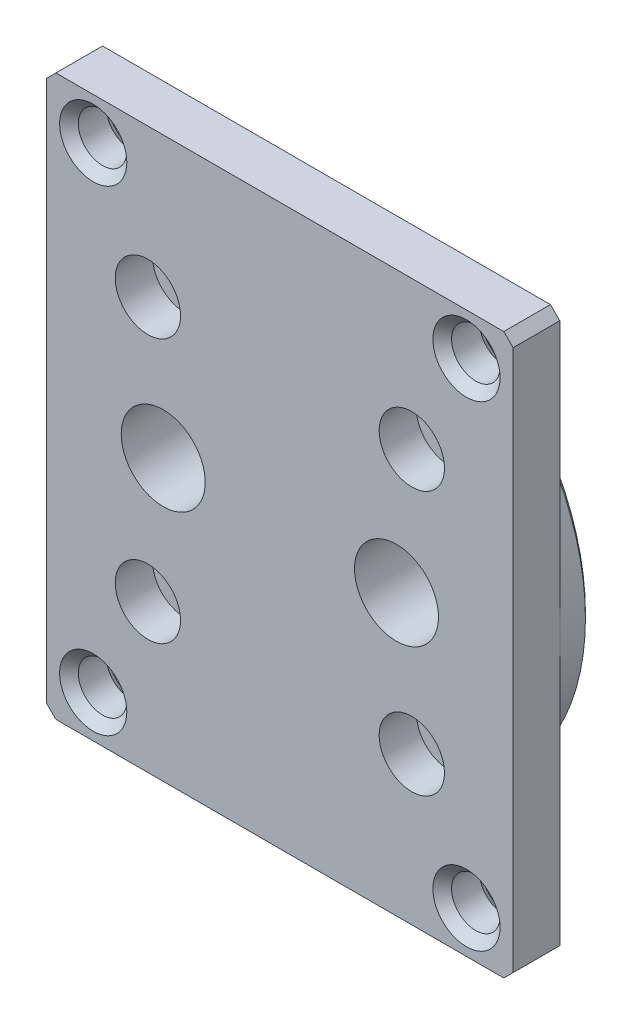
ISO-10303-21;
HEADER;
FILE_DESCRIPTION(('STEP AP214'),'2;1');
FILE_NAME('part.step','',(''),(''),'','','');
FILE_SCHEMA(('AUTOMOTIVE_DESIGN { 1 0 10303 214 1 1 1 1 }'));
ENDSEC;
DATA;
#1=APPLICATION_CONTEXT('core data for automotive mechanical design processes');
#2=APPLICATION_PROTOCOL_DEFINITION('international standard','automotive_design',2000,#1);
#3=PRODUCT_CONTEXT('',#1,'mechanical');
#4=PRODUCT('Part','Part','',(#3));
#5=PRODUCT_RELATED_PRODUCT_CATEGORY('part','',(#4));
#6=PRODUCT_DEFINITION_FORMATION('','',#4);
#7=PRODUCT_DEFINITION_CONTEXT('part definition',#1,'design');
#8=PRODUCT_DEFINITION('design','',#6,#7);
#9=PRODUCT_DEFINITION_SHAPE('','',#8);
#10=(LENGTH_UNIT() NAMED_UNIT(*) SI_UNIT(.MILLI.,.METRE.));
#11=(NAMED_UNIT(*) PLANE_ANGLE_UNIT() SI_UNIT($,.RADIAN.));
#12=(NAMED_UNIT(*) SI_UNIT($,.STERADIAN.) SOLID_ANGLE_UNIT());
#13=UNCERTAINTY_MEASURE_WITH_UNIT(LENGTH_MEASURE(1.E-05),#10,'distance_accuracy_value','');
#14=(GEOMETRIC_REPRESENTATION_CONTEXT(3) GLOBAL_UNCERTAINTY_ASSIGNED_CONTEXT((#13)) GLOBAL_UNIT_ASSIGNED_CONTEXT((#10,
#11,#12)) REPRESENTATION_CONTEXT('',''));
#15=CARTESIAN_POINT('',(0.,0.,0.));
#16=DIRECTION('',(0.,0.,1.));
#17=DIRECTION('',(1.,0.,0.));
#18=AXIS2_PLACEMENT_3D('',#15,#16,#17);
#19=CARTESIAN_POINT('',(14.142135623731,-14.1421356237309,8.25));
#20=DIRECTION('',(0.,0.,-1.));
#21=DIRECTION('',(-1.,0.,0.));
#22=AXIS2_PLACEMENT_3D('',#19,#20,#21);
#23=CYLINDRICAL_SURFACE('',#22,1.75);
#24=CARTESIAN_POINT('',(14.142135623731,-14.1421356237309,0.500000000000016));
#25=DIRECTION('',(0.,0.,1.));
#26=DIRECTION('',(1.,0.,0.));
#27=AXIS2_PLACEMENT_3D('',#24,#25,#26);
#28=CIRCLE('',#27,1.75);
#29=CARTESIAN_POINT('',(15.892135623731,-14.1421356237309,0.500000000000016));
#30=VERTEX_POINT('',#29);
#31=EDGE_CURVE('E216',#30,#30,#28,.F.);
#32=ORIENTED_EDGE('',*,*,#31,.T.);
#33=EDGE_LOOP('',(#32));
#34=FACE_BOUND('',#33,.T.);
#35=CARTESIAN_POINT('',(14.142135623731,-14.1421356237309,4.25));
#36=DIRECTION('',(0.,0.,1.));
#37=DIRECTION('',(1.,0.,0.));
#38=AXIS2_PLACEMENT_3D('',#35,#36,#37);
#39=CIRCLE('',#38,1.75);
#40=CARTESIAN_POINT('',(15.892135623731,-14.1421356237309,4.25));
#41=VERTEX_POINT('',#40);
#42=EDGE_CURVE('E176',#41,#41,#39,.F.);
#43=ORIENTED_EDGE('',*,*,#42,.F.);
#44=EDGE_LOOP('',(#43));
#45=FACE_BOUND('',#44,.T.);
#46=ADVANCED_FACE('F41',(#34,#45),#23,.F.);
#47=CARTESIAN_POINT('',(-14.142135623731,-14.1421356237309,8.25));
#48=DIRECTION('',(0.,0.,-1.));
#49=DIRECTION('',(-1.,0.,0.));
#50=AXIS2_PLACEMENT_3D('',#47,#48,#49);
#51=CYLINDRICAL_SURFACE('',#50,1.75);
#52=CARTESIAN_POINT('',(-14.142135623731,-14.1421356237309,0.500000000000007));
#53=DIRECTION('',(0.,0.,1.));
#54=DIRECTION('',(1.,0.,0.));
#55=AXIS2_PLACEMENT_3D('',#52,#53,#54);
#56=CIRCLE('',#55,1.75);
#57=CARTESIAN_POINT('',(-12.392135623731,-14.1421356237309,0.500000000000007));
#58=VERTEX_POINT('',#57);
#59=EDGE_CURVE('E220',#58,#58,#56,.F.);
#60=ORIENTED_EDGE('',*,*,#59,.T.);
#61=EDGE_LOOP('',(#60));
#62=FACE_BOUND('',#61,.T.);
#63=CARTESIAN_POINT('',(-14.142135623731,-14.1421356237309,4.25));
#64=DIRECTION('',(0.,0.,1.));
#65=DIRECTION('',(1.,0.,0.));
#66=AXIS2_PLACEMENT_3D('',#63,#64,#65);
#67=CIRCLE('',#66,1.75);
#68=CARTESIAN_POINT('',(-12.392135623731,-14.1421356237309,4.25));
#69=VERTEX_POINT('',#68);
#70=EDGE_CURVE('E171',#69,#69,#67,.F.);
#71=ORIENTED_EDGE('',*,*,#70,.F.);
#72=EDGE_LOOP('',(#71));
#73=FACE_BOUND('',#72,.T.);
#74=ADVANCED_FACE('F419',(#62,#73),#51,.F.);
#75=CARTESIAN_POINT('',(14.142135623731,14.142135623731,8.25));
#76=DIRECTION('',(0.,0.,-1.));
#77=DIRECTION('',(-1.,0.,0.));
#78=AXIS2_PLACEMENT_3D('',#75,#76,#77);
#79=CYLINDRICAL_SURFACE('',#78,1.75);
#80=CARTESIAN_POINT('',(14.142135623731,14.142135623731,0.500000000000004));
#81=DIRECTION('',(0.,0.,1.));
#82=DIRECTION('',(1.,0.,0.));
#83=AXIS2_PLACEMENT_3D('',#80,#81,#82);
#84=CIRCLE('',#83,1.75);
#85=CARTESIAN_POINT('',(15.892135623731,14.142135623731,0.500000000000004));
#86=VERTEX_POINT('',#85);
#87=EDGE_CURVE('E228',#86,#86,#84,.F.);
#88=ORIENTED_EDGE('',*,*,#87,.T.);
#89=EDGE_LOOP('',(#88));
#90=FACE_BOUND('',#89,.T.);
#91=CARTESIAN_POINT('',(14.142135623731,14.142135623731,4.25));
#92=DIRECTION('',(0.,0.,1.));
#93=DIRECTION('',(1.,0.,0.));
#94=AXIS2_PLACEMENT_3D('',#91,#92,#93);
#95=CIRCLE('',#94,1.75);
#96=CARTESIAN_POINT('',(15.892135623731,14.142135623731,4.25));
#97=VERTEX_POINT('',#96);
#98=EDGE_CURVE('E167',#97,#97,#95,.F.);
#99=ORIENTED_EDGE('',*,*,#98,.F.);
#100=EDGE_LOOP('',(#99));
#101=FACE_BOUND('',#100,.T.);
#102=ADVANCED_FACE('F425',(#90,#101),#79,.F.);
#103=CARTESIAN_POINT('',(-14.142135623731,14.142135623731,8.25));
#104=DIRECTION('',(0.,0.,-1.));
#105=DIRECTION('',(-1.,0.,0.));
#106=AXIS2_PLACEMENT_3D('',#103,#104,#105);
#107=CYLINDRICAL_SURFACE('',#106,1.75);
#108=CARTESIAN_POINT('',(-14.142135623731,14.142135623731,0.500000000000007));
#109=DIRECTION('',(0.,0.,1.));
#110=DIRECTION('',(1.,0.,0.));
#111=AXIS2_PLACEMENT_3D('',#108,#109,#110);
#112=CIRCLE('',#111,1.75);
#113=CARTESIAN_POINT('',(-12.392135623731,14.142135623731,0.500000000000007));
#114=VERTEX_POINT('',#113);
#115=EDGE_CURVE('E224',#114,#114,#112,.F.);
#116=ORIENTED_EDGE('',*,*,#115,.T.);
#117=EDGE_LOOP('',(#116));
#118=FACE_BOUND('',#117,.T.);
#119=CARTESIAN_POINT('',(-14.142135623731,14.142135623731,4.25));
#120=DIRECTION('',(0.,0.,1.));
#121=DIRECTION('',(1.,0.,0.));
#122=AXIS2_PLACEMENT_3D('',#119,#120,#121);
#123=CIRCLE('',#122,1.75);
#124=CARTESIAN_POINT('',(-12.392135623731,14.142135623731,4.25));
#125=VERTEX_POINT('',#124);
#126=EDGE_CURVE('E161',#125,#125,#123,.F.);
#127=ORIENTED_EDGE('',*,*,#126,.F.);
#128=EDGE_LOOP('',(#127));
#129=FACE_BOUND('',#128,.T.);
#130=ADVANCED_FACE('F434',(#118,#129),#107,.F.);
#131=CARTESIAN_POINT('',(0.,0.,8.25));
#132=DIRECTION('',(0.,0.,-1.));
#133=DIRECTION('',(-1.,0.,0.));
#134=AXIS2_PLACEMENT_3D('',#131,#132,#133);
#135=CYLINDRICAL_SURFACE('',#134,25.);
#136=CARTESIAN_POINT('',(0.,0.,0.5));
#137=DIRECTION('',(0.,0.,1.));
#138=DIRECTION('',(1.,0.,0.));
#139=AXIS2_PLACEMENT_3D('',#136,#137,#138);
#140=CIRCLE('',#139,25.);
#141=CARTESIAN_POINT('',(25.,0.,0.5));
#142=VERTEX_POINT('',#141);
#143=EDGE_CURVE('E136',#142,#142,#140,.T.);
#144=ORIENTED_EDGE('',*,*,#143,.T.);
#145=EDGE_LOOP('',(#144));
#146=FACE_BOUND('',#145,.T.);
#147=CARTESIAN_POINT('',(0.,0.,3.25));
#148=DIRECTION('',(0.,0.,1.));
#149=DIRECTION('',(1.,0.,0.));
#150=AXIS2_PLACEMENT_3D('',#147,#148,#149);
#151=CIRCLE('',#150,25.);
#152=CARTESIAN_POINT('',(25.,0.,3.25));
#153=VERTEX_POINT('',#152);
#154=CARTESIAN_POINT('',(-25.,0.,3.25));
#155=VERTEX_POINT('',#154);
#156=EDGE_CURVE('E130',#153,#155,#151,.T.);
#157=ORIENTED_EDGE('',*,*,#156,.F.);
#158=EDGE_CURVE('E125',#155,#153,#151,.T.);
#159=ORIENTED_EDGE('',*,*,#158,.F.);
#160=EDGE_LOOP('',(#157,#159));
#161=FACE_BOUND('',#160,.T.);
#162=ADVANCED_FACE('F131',(#146,#161),#135,.T.);
#163=CARTESIAN_POINT('',(0.,0.,0.));
#164=DIRECTION('',(0.,0.,1.));
#165=DIRECTION('',(1.,0.,0.));
#166=AXIS2_PLACEMENT_3D('',#163,#164,#165);
#167=PLANE('',#166);
#168=CARTESIAN_POINT('',(0.,0.,0.));
#169=DIRECTION('',(0.,0.,1.));
#170=DIRECTION('',(1.,0.,0.));
#171=AXIS2_PLACEMENT_3D('',#168,#169,#170);
#172=CIRCLE('',#171,24.5);
#173=CARTESIAN_POINT('',(24.5,0.,0.));
#174=VERTEX_POINT('',#173);
#175=EDGE_CURVE('E208',#174,#174,#172,.F.);
#176=ORIENTED_EDGE('',*,*,#175,.T.);
#177=EDGE_LOOP('',(#176));
#178=FACE_BOUND('',#177,.T.);
#179=CARTESIAN_POINT('',(-12.5,0.,0.));
#180=DIRECTION('',(0.,0.,1.));
#181=DIRECTION('',(1.,0.,0.));
#182=AXIS2_PLACEMENT_3D('',#179,#180,#181);
#183=CIRCLE('',#182,5.);
#184=CARTESIAN_POINT('',(-7.50000000000001,0.,0.));
#185=VERTEX_POINT('',#184);
#186=EDGE_CURVE('E204',#185,#185,#183,.T.);
#187=ORIENTED_EDGE('',*,*,#186,.T.);
#188=EDGE_LOOP('',(#187));
#189=FACE_BOUND('',#188,.T.);
#190=CARTESIAN_POINT('',(14.142135623731,-14.1421356237309,0.));
#191=DIRECTION('',(0.,0.,1.));
#192=DIRECTION('',(1.,0.,0.));
#193=AXIS2_PLACEMENT_3D('',#190,#191,#192);
#194=CIRCLE('',#193,2.25000000000001);
#195=CARTESIAN_POINT('',(16.392135623731,-14.1421356237309,0.));
#196=VERTEX_POINT('',#195);
#197=EDGE_CURVE('E200',#196,#196,#194,.T.);
#198=ORIENTED_EDGE('',*,*,#197,.T.);
#199=EDGE_LOOP('',(#198));
#200=FACE_BOUND('',#199,.T.);
#201=CARTESIAN_POINT('',(-14.142135623731,-14.1421356237309,0.));
#202=DIRECTION('',(0.,0.,1.));
#203=DIRECTION('',(1.,0.,0.));
#204=AXIS2_PLACEMENT_3D('',#201,#202,#203);
#205=CIRCLE('',#204,2.25);
#206=CARTESIAN_POINT('',(-11.892135623731,-14.1421356237309,0.));
#207=VERTEX_POINT('',#206);
#208=EDGE_CURVE('E196',#207,#207,#205,.T.);
#209=ORIENTED_EDGE('',*,*,#208,.T.);
#210=EDGE_LOOP('',(#209));
#211=FACE_BOUND('',#210,.T.);
#212=CARTESIAN_POINT('',(-14.142135623731,14.142135623731,0.));
#213=DIRECTION('',(0.,0.,1.));
#214=DIRECTION('',(1.,0.,0.));
#215=AXIS2_PLACEMENT_3D('',#212,#213,#214);
#216=CIRCLE('',#215,2.25);
#217=CARTESIAN_POINT('',(-11.892135623731,14.142135623731,0.));
#218=VERTEX_POINT('',#217);
#219=EDGE_CURVE('E192',#218,#218,#216,.T.);
#220=ORIENTED_EDGE('',*,*,#219,.T.);
#221=EDGE_LOOP('',(#220));
#222=FACE_BOUND('',#221,.T.);
#223=CARTESIAN_POINT('',(14.142135623731,14.142135623731,0.));
#224=DIRECTION('',(0.,0.,1.));
#225=DIRECTION('',(1.,0.,0.));
#226=AXIS2_PLACEMENT_3D('',#223,#224,#225);
#227=CIRCLE('',#226,2.25);
#228=CARTESIAN_POINT('',(16.392135623731,14.142135623731,0.));
#229=VERTEX_POINT('',#228);
#230=EDGE_CURVE('E188',#229,#229,#227,.T.);
#231=ORIENTED_EDGE('',*,*,#230,.T.);
#232=EDGE_LOOP('',(#231));
#233=FACE_BOUND('',#232,.T.);
#234=CARTESIAN_POINT('',(12.5,0.,0.));
#235=DIRECTION('',(0.,0.,1.));
#236=DIRECTION('',(1.,0.,0.));
#237=AXIS2_PLACEMENT_3D('',#234,#235,#236);
#238=CIRCLE('',#237,5.00000000000002);
#239=CARTESIAN_POINT('',(17.5,0.,0.));
#240=VERTEX_POINT('',#239);
#241=EDGE_CURVE('E184',#240,#240,#238,.T.);
#242=ORIENTED_EDGE('',*,*,#241,.T.);
#243=EDGE_LOOP('',(#242));
#244=FACE_BOUND('',#243,.T.);
#245=ADVANCED_FACE('F441',(#178,#189,#200,#211,#222,#233,#244),#167,.F.);
#246=CARTESIAN_POINT('',(0.,0.,3.25));
#247=DIRECTION('',(0.,0.,1.));
#248=DIRECTION('',(1.,0.,0.));
#249=AXIS2_PLACEMENT_3D('',#246,#247,#248);
#250=PLANE('',#249);
#251=CARTESIAN_POINT('',(20.,25.5,3.25));
#252=DIRECTION('',(0.,0.,1.));
#253=DIRECTION('',(1.,0.,0.));
#254=AXIS2_PLACEMENT_3D('',#251,#252,#253);
#255=CIRCLE('',#254,3.59999999999999);
#256=CARTESIAN_POINT('',(23.6,25.5,3.25));
#257=VERTEX_POINT('',#256);
#258=EDGE_CURVE('E253',#257,#257,#255,.T.);
#259=ORIENTED_EDGE('',*,*,#258,.T.);
#260=EDGE_LOOP('',(#259));
#261=FACE_BOUND('',#260,.T.);
#262=CARTESIAN_POINT('',(-20.,25.5,3.25));
#263=DIRECTION('',(0.,0.,1.));
#264=DIRECTION('',(1.,0.,0.));
#265=AXIS2_PLACEMENT_3D('',#262,#263,#264);
#266=CIRCLE('',#265,3.59999999999999);
#267=CARTESIAN_POINT('',(-16.4,25.5,3.25));
#268=VERTEX_POINT('',#267);
#269=EDGE_CURVE('E249',#268,#268,#266,.T.);
#270=ORIENTED_EDGE('',*,*,#269,.T.);
#271=EDGE_LOOP('',(#270));
#272=FACE_BOUND('',#271,.T.);
#273=DIRECTION('',(0.,-1.,0.));
#274=VECTOR('',#273,1.);
#275=CARTESIAN_POINT('',(-25.,25.,3.25));
#276=LINE('',#275,#274);
#277=CARTESIAN_POINT('',(-25.,29.,3.25));
#278=VERTEX_POINT('',#277);
#279=EDGE_CURVE('E147',#278,#155,#276,.T.);
#280=ORIENTED_EDGE('',*,*,#279,.F.);
#281=DIRECTION('',(-0.707106781186548,-0.707106781186548,0.));
#282=VECTOR('',#281,1.);
#283=CARTESIAN_POINT('',(-24.,30.,3.25));
#284=LINE('',#283,#282);
#285=CARTESIAN_POINT('',(-24.,30.,3.25));
#286=VERTEX_POINT('',#285);
#287=EDGE_CURVE('E246',#278,#286,#284,.F.);
#288=ORIENTED_EDGE('',*,*,#287,.T.);
#289=DIRECTION('',(1.,0.,0.));
#290=VECTOR('',#289,1.);
#291=CARTESIAN_POINT('',(-25.,30.,3.25));
#292=LINE('',#291,#290);
#293=CARTESIAN_POINT('',(24.,30.,3.25));
#294=VERTEX_POINT('',#293);
#295=EDGE_CURVE('E360',#286,#294,#292,.T.);
#296=ORIENTED_EDGE('',*,*,#295,.T.);
#297=DIRECTION('',(-0.707106781186548,0.707106781186548,0.));
#298=VECTOR('',#297,1.);
#299=CARTESIAN_POINT('',(25.,29.,3.25));
#300=LINE('',#299,#298);
#301=CARTESIAN_POINT('',(25.,29.,3.25));
#302=VERTEX_POINT('',#301);
#303=EDGE_CURVE('E145',#294,#302,#300,.F.);
#304=ORIENTED_EDGE('',*,*,#303,.T.);
#305=DIRECTION('',(0.,1.,0.));
#306=VECTOR('',#305,1.);
#307=CARTESIAN_POINT('',(25.,25.,3.25));
#308=LINE('',#307,#306);
#309=EDGE_CURVE('E120',#153,#302,#308,.T.);
#310=ORIENTED_EDGE('',*,*,#309,.F.);
#311=ORIENTED_EDGE('',*,*,#156,.T.);
#312=EDGE_LOOP('',(#280,#288,#296,#304,#310,#311));
#313=FACE_BOUND('',#312,.T.);
#314=ADVANCED_FACE('F142',(#261,#272,#313),#250,.F.);
#315=CARTESIAN_POINT('',(-20.,-25.5,3.25));
#316=DIRECTION('',(0.,0.,1.));
#317=DIRECTION('',(1.,0.,0.));
#318=AXIS2_PLACEMENT_3D('',#315,#316,#317);
#319=CIRCLE('',#318,3.60000000000001);
#320=CARTESIAN_POINT('',(-16.4,-25.5,3.25));
#321=VERTEX_POINT('',#320);
#322=EDGE_CURVE('E310',#321,#321,#319,.T.);
#323=ORIENTED_EDGE('',*,*,#322,.T.);
#324=EDGE_LOOP('',(#323));
#325=FACE_BOUND('',#324,.T.);
#326=CARTESIAN_POINT('',(20.,-25.5,3.25));
#327=DIRECTION('',(0.,0.,1.));
#328=DIRECTION('',(1.,0.,0.));
#329=AXIS2_PLACEMENT_3D('',#326,#327,#328);
#330=CIRCLE('',#329,3.59999999999999);
#331=CARTESIAN_POINT('',(23.6,-25.5,3.25));
#332=VERTEX_POINT('',#331);
#333=EDGE_CURVE('E306',#332,#332,#330,.T.);
#334=ORIENTED_EDGE('',*,*,#333,.T.);
#335=EDGE_LOOP('',(#334));
#336=FACE_BOUND('',#335,.T.);
#337=DIRECTION('',(-1.,0.,0.));
#338=VECTOR('',#337,1.);
#339=CARTESIAN_POINT('',(-25.,-30.,3.25));
#340=LINE('',#339,#338);
#341=CARTESIAN_POINT('',(24.,-30.,3.25));
#342=VERTEX_POINT('',#341);
#343=CARTESIAN_POINT('',(-24.,-30.,3.25));
#344=VERTEX_POINT('',#343);
#345=EDGE_CURVE('E353',#342,#344,#340,.T.);
#346=ORIENTED_EDGE('',*,*,#345,.T.);
#347=DIRECTION('',(0.707106781186546,-0.707106781186549,0.));
#348=VECTOR('',#347,1.);
#349=CARTESIAN_POINT('',(-25.,-29.,3.25));
#350=LINE('',#349,#348);
#351=CARTESIAN_POINT('',(-25.,-29.,3.25));
#352=VERTEX_POINT('',#351);
#353=EDGE_CURVE('E303',#344,#352,#350,.F.);
#354=ORIENTED_EDGE('',*,*,#353,.T.);
#355=EDGE_CURVE('E140',#155,#352,#276,.T.);
#356=ORIENTED_EDGE('',*,*,#355,.F.);
#357=ORIENTED_EDGE('',*,*,#158,.T.);
#358=CARTESIAN_POINT('',(25.,-29.,3.25));
#359=VERTEX_POINT('',#358);
#360=EDGE_CURVE('E114',#359,#153,#308,.T.);
#361=ORIENTED_EDGE('',*,*,#360,.F.);
#362=DIRECTION('',(0.707106781186545,0.70710678118655,0.));
#363=VECTOR('',#362,1.);
#364=CARTESIAN_POINT('',(24.,-30.,3.25));
#365=LINE('',#364,#363);
#366=EDGE_CURVE('E65',#359,#342,#365,.F.);
#367=ORIENTED_EDGE('',*,*,#366,.T.);
#368=EDGE_LOOP('',(#346,#354,#356,#357,#361,#367));
#369=FACE_BOUND('',#368,.T.);
#370=ADVANCED_FACE('F138',(#325,#336,#369),#250,.F.);
#371=CARTESIAN_POINT('',(-25.,25.,3.25));
#372=DIRECTION('',(-1.,0.,0.));
#373=DIRECTION('',(0.,-1.,0.));
#374=AXIS2_PLACEMENT_3D('',#371,#372,#373);
#375=PLANE('',#374);
#376=DIRECTION('',(0.,-1.,0.));
#377=VECTOR('',#376,1.);
#378=CARTESIAN_POINT('',(-25.,25.,8.25));
#379=LINE('',#378,#377);
#380=CARTESIAN_POINT('',(-25.,29.,8.25));
#381=VERTEX_POINT('',#380);
#382=CARTESIAN_POINT('',(-25.,-29.,8.25));
#383=VERTEX_POINT('',#382);
#384=EDGE_CURVE('E152',#381,#383,#379,.T.);
#385=ORIENTED_EDGE('',*,*,#384,.F.);
#386=DIRECTION('',(0.,0.,-1.));
#387=VECTOR('',#386,1.);
#388=CARTESIAN_POINT('',(-25.,29.,3.25));
#389=LINE('',#388,#387);
#390=EDGE_CURVE('E333',#381,#278,#389,.T.);
#391=ORIENTED_EDGE('',*,*,#390,.T.);
#392=ORIENTED_EDGE('',*,*,#279,.T.);
#393=ORIENTED_EDGE('',*,*,#355,.T.);
#394=DIRECTION('',(0.,0.,1.));
#395=VECTOR('',#394,1.);
#396=CARTESIAN_POINT('',(-25.,-29.,3.25));
#397=LINE('',#396,#395);
#398=EDGE_CURVE('E329',#352,#383,#397,.T.);
#399=ORIENTED_EDGE('',*,*,#398,.T.);
#400=EDGE_LOOP('',(#385,#391,#392,#393,#399));
#401=FACE_BOUND('',#400,.T.);
#402=ADVANCED_FACE('F584',(#401),#375,.T.);
#403=CARTESIAN_POINT('',(25.,25.,3.25));
#404=DIRECTION('',(1.,0.,0.));
#405=DIRECTION('',(0.,1.,0.));
#406=AXIS2_PLACEMENT_3D('',#403,#404,#405);
#407=PLANE('',#406);
#408=DIRECTION('',(0.,1.,0.));
#409=VECTOR('',#408,1.);
#410=CARTESIAN_POINT('',(25.,25.,8.25));
#411=LINE('',#410,#409);
#412=CARTESIAN_POINT('',(25.,-29.,8.25));
#413=VERTEX_POINT('',#412);
#414=CARTESIAN_POINT('',(25.,29.,8.25));
#415=VERTEX_POINT('',#414);
#416=EDGE_CURVE('E156',#413,#415,#411,.T.);
#417=ORIENTED_EDGE('',*,*,#416,.F.);
#418=DIRECTION('',(0.,0.,-1.));
#419=VECTOR('',#418,1.);
#420=CARTESIAN_POINT('',(25.,-29.,3.25));
#421=LINE('',#420,#419);
#422=EDGE_CURVE('E11',#413,#359,#421,.T.);
#423=ORIENTED_EDGE('',*,*,#422,.T.);
#424=ORIENTED_EDGE('',*,*,#360,.T.);
#425=ORIENTED_EDGE('',*,*,#309,.T.);
#426=DIRECTION('',(0.,0.,1.));
#427=VECTOR('',#426,1.);
#428=CARTESIAN_POINT('',(25.,29.,3.25));
#429=LINE('',#428,#427);
#430=EDGE_CURVE('E51',#302,#415,#429,.T.);
#431=ORIENTED_EDGE('',*,*,#430,.T.);
#432=EDGE_LOOP('',(#417,#423,#424,#425,#431));
#433=FACE_BOUND('',#432,.T.);
#434=ADVANCED_FACE('F117',(#433),#407,.T.);
#435=CARTESIAN_POINT('',(0.,0.,8.25));
#436=DIRECTION('',(0.,0.,1.));
#437=DIRECTION('',(1.,0.,0.));
#438=AXIS2_PLACEMENT_3D('',#435,#436,#437);
#439=PLANE('',#438);
#440=CARTESIAN_POINT('',(20.,25.5,8.25));
#441=DIRECTION('',(0.,0.,1.));
#442=DIRECTION('',(1.,0.,0.));
#443=AXIS2_PLACEMENT_3D('',#440,#441,#442);
#444=CIRCLE('',#443,3.6);
#445=CARTESIAN_POINT('',(23.6,25.5,8.25));
#446=VERTEX_POINT('',#445);
#447=EDGE_CURVE('E281',#446,#446,#444,.F.);
#448=ORIENTED_EDGE('',*,*,#447,.T.);
#449=EDGE_LOOP('',(#448));
#450=FACE_BOUND('',#449,.T.);
#451=CARTESIAN_POINT('',(-20.,25.5,8.25));
#452=DIRECTION('',(0.,0.,1.));
#453=DIRECTION('',(1.,0.,0.));
#454=AXIS2_PLACEMENT_3D('',#451,#452,#453);
#455=CIRCLE('',#454,3.6);
#456=CARTESIAN_POINT('',(-16.4,25.5,8.25));
#457=VERTEX_POINT('',#456);
#458=EDGE_CURVE('E277',#457,#457,#455,.F.);
#459=ORIENTED_EDGE('',*,*,#458,.T.);
#460=EDGE_LOOP('',(#459));
#461=FACE_BOUND('',#460,.T.);
#462=CARTESIAN_POINT('',(-20.,-25.5,8.25));
#463=DIRECTION('',(0.,0.,1.));
#464=DIRECTION('',(1.,0.,0.));
#465=AXIS2_PLACEMENT_3D('',#462,#463,#464);
#466=CIRCLE('',#465,3.6);
#467=CARTESIAN_POINT('',(-16.4,-25.5,8.25));
#468=VERTEX_POINT('',#467);
#469=EDGE_CURVE('E273',#468,#468,#466,.F.);
#470=ORIENTED_EDGE('',*,*,#469,.T.);
#471=EDGE_LOOP('',(#470));
#472=FACE_BOUND('',#471,.T.);
#473=CARTESIAN_POINT('',(20.,-25.5,8.25));
#474=DIRECTION('',(0.,0.,1.));
#475=DIRECTION('',(1.,0.,0.));
#476=AXIS2_PLACEMENT_3D('',#473,#474,#475);
#477=CIRCLE('',#476,3.6);
#478=CARTESIAN_POINT('',(23.6,-25.5,8.25));
#479=VERTEX_POINT('',#478);
#480=EDGE_CURVE('E269',#479,#479,#477,.F.);
#481=ORIENTED_EDGE('',*,*,#480,.T.);
#482=EDGE_LOOP('',(#481));
#483=FACE_BOUND('',#482,.T.);
#484=CARTESIAN_POINT('',(-14.142135623731,-14.142135623731,8.25));
#485=DIRECTION('',(0.,0.,1.));
#486=DIRECTION('',(0.,1.,0.));
#487=AXIS2_PLACEMENT_3D('',#484,#485,#486);
#488=CIRCLE('',#487,3.5);
#489=CARTESIAN_POINT('',(-14.142135623731,-10.642135623731,8.25));
#490=VERTEX_POINT('',#489);
#491=EDGE_CURVE('E370',#490,#490,#488,.T.);
#492=ORIENTED_EDGE('',*,*,#491,.F.);
#493=EDGE_LOOP('',(#492));
#494=FACE_BOUND('',#493,.T.);
#495=CARTESIAN_POINT('',(14.142135623731,-14.142135623731,8.25));
#496=DIRECTION('',(0.,0.,1.));
#497=DIRECTION('',(-1.,0.,0.));
#498=AXIS2_PLACEMENT_3D('',#495,#496,#497);
#499=CIRCLE('',#498,3.5);
#500=CARTESIAN_POINT('',(10.642135623731,-14.142135623731,8.25));
#501=VERTEX_POINT('',#500);
#502=EDGE_CURVE('E378',#501,#501,#499,.T.);
#503=ORIENTED_EDGE('',*,*,#502,.F.);
#504=EDGE_LOOP('',(#503));
#505=FACE_BOUND('',#504,.T.);
#506=CARTESIAN_POINT('',(14.1421356237309,14.1421356237311,8.25));
#507=DIRECTION('',(0.,0.,1.));
#508=DIRECTION('',(0.,-1.,0.));
#509=AXIS2_PLACEMENT_3D('',#506,#507,#508);
#510=CIRCLE('',#509,3.5);
#511=CARTESIAN_POINT('',(14.1421356237309,10.6421356237311,8.25));
#512=VERTEX_POINT('',#511);
#513=EDGE_CURVE('E365',#512,#512,#510,.T.);
#514=ORIENTED_EDGE('',*,*,#513,.F.);
#515=EDGE_LOOP('',(#514));
#516=FACE_BOUND('',#515,.T.);
#517=CARTESIAN_POINT('',(-14.142135623731,14.142135623731,8.25));
#518=DIRECTION('',(0.,0.,1.));
#519=DIRECTION('',(1.,0.,0.));
#520=AXIS2_PLACEMENT_3D('',#517,#518,#519);
#521=CIRCLE('',#520,3.5);
#522=CARTESIAN_POINT('',(-10.642135623731,14.142135623731,8.25));
#523=VERTEX_POINT('',#522);
#524=EDGE_CURVE('E180',#523,#523,#521,.T.);
#525=ORIENTED_EDGE('',*,*,#524,.F.);
#526=EDGE_LOOP('',(#525));
#527=FACE_BOUND('',#526,.T.);
#528=CARTESIAN_POINT('',(12.5,0.,8.25));
#529=DIRECTION('',(0.,0.,-1.));
#530=DIRECTION('',(-1.,0.,0.));
#531=AXIS2_PLACEMENT_3D('',#528,#529,#530);
#532=CIRCLE('',#531,4.5);
#533=CARTESIAN_POINT('',(8.,0.,8.25));
#534=VERTEX_POINT('',#533);
#535=EDGE_CURVE('E165',#534,#534,#532,.T.);
#536=ORIENTED_EDGE('',*,*,#535,.T.);
#537=EDGE_LOOP('',(#536));
#538=FACE_BOUND('',#537,.T.);
#539=CARTESIAN_POINT('',(-12.5,0.,8.25));
#540=DIRECTION('',(0.,0.,-1.));
#541=DIRECTION('',(-1.,0.,0.));
#542=AXIS2_PLACEMENT_3D('',#539,#540,#541);
#543=CIRCLE('',#542,4.5);
#544=CARTESIAN_POINT('',(-17.,0.,8.25));
#545=VERTEX_POINT('',#544);
#546=EDGE_CURVE('E157',#545,#545,#543,.T.);
#547=ORIENTED_EDGE('',*,*,#546,.T.);
#548=EDGE_LOOP('',(#547));
#549=FACE_BOUND('',#548,.T.);
#550=DIRECTION('',(-1.,0.,0.));
#551=VECTOR('',#550,1.);
#552=CARTESIAN_POINT('',(-25.,30.,8.25));
#553=LINE('',#552,#551);
#554=CARTESIAN_POINT('',(24.,30.,8.25));
#555=VERTEX_POINT('',#554);
#556=CARTESIAN_POINT('',(-24.,30.,8.25));
#557=VERTEX_POINT('',#556);
#558=EDGE_CURVE('E356',#555,#557,#553,.T.);
#559=ORIENTED_EDGE('',*,*,#558,.T.);
#560=DIRECTION('',(0.707106781186548,0.707106781186548,0.));
#561=VECTOR('',#560,1.);
#562=CARTESIAN_POINT('',(-27.,27.,8.25));
#563=LINE('',#562,#561);
#564=EDGE_CURVE('E266',#557,#381,#563,.F.);
#565=ORIENTED_EDGE('',*,*,#564,.T.);
#566=ORIENTED_EDGE('',*,*,#384,.T.);
#567=DIRECTION('',(-0.707106781186546,0.707106781186549,0.));
#568=VECTOR('',#567,1.);
#569=CARTESIAN_POINT('',(-27.0000000000001,-27.,8.25));
#570=LINE('',#569,#568);
#571=CARTESIAN_POINT('',(-24.,-30.,8.25));
#572=VERTEX_POINT('',#571);
#573=EDGE_CURVE('E263',#383,#572,#570,.F.);
#574=ORIENTED_EDGE('',*,*,#573,.T.);
#575=DIRECTION('',(1.,0.,0.));
#576=VECTOR('',#575,1.);
#577=CARTESIAN_POINT('',(-25.,-30.,8.25));
#578=LINE('',#577,#576);
#579=CARTESIAN_POINT('',(24.,-30.,8.25));
#580=VERTEX_POINT('',#579);
#581=EDGE_CURVE('E348',#572,#580,#578,.T.);
#582=ORIENTED_EDGE('',*,*,#581,.T.);
#583=DIRECTION('',(-0.707106781186545,-0.70710678118655,0.));
#584=VECTOR('',#583,1.);
#585=CARTESIAN_POINT('',(27.0000000000001,-26.9999999999999,8.25));
#586=LINE('',#585,#584);
#587=EDGE_CURVE('E260',#580,#413,#586,.F.);
#588=ORIENTED_EDGE('',*,*,#587,.T.);
#589=ORIENTED_EDGE('',*,*,#416,.T.);
#590=DIRECTION('',(0.707106781186548,-0.707106781186548,0.));
#591=VECTOR('',#590,1.);
#592=CARTESIAN_POINT('',(27.,27.,8.25));
#593=LINE('',#592,#591);
#594=EDGE_CURVE('E257',#415,#555,#593,.F.);
#595=ORIENTED_EDGE('',*,*,#594,.T.);
#596=EDGE_LOOP('',(#559,#565,#566,#574,#582,#588,#589,#595));
#597=FACE_BOUND('',#596,.T.);
#598=ADVANCED_FACE('F345',(#450,#461,#472,#483,#494,#505,#516,#527,#538,#549,#597),#439,.T.);
#599=CARTESIAN_POINT('',(-12.5,0.,8.25));
#600=DIRECTION('',(0.,0.,-1.));
#601=DIRECTION('',(-1.,0.,0.));
#602=AXIS2_PLACEMENT_3D('',#599,#600,#601);
#603=CYLINDRICAL_SURFACE('',#602,4.5);
#604=CARTESIAN_POINT('',(-12.5,0.,0.499999999999998));
#605=DIRECTION('',(0.,0.,1.));
#606=DIRECTION('',(1.,0.,0.));
#607=AXIS2_PLACEMENT_3D('',#604,#605,#606);
#608=CIRCLE('',#607,4.5);
#609=CARTESIAN_POINT('',(-8.,0.,0.499999999999998));
#610=VERTEX_POINT('',#609);
#611=EDGE_CURVE('E212',#610,#610,#608,.F.);
#612=ORIENTED_EDGE('',*,*,#611,.T.);
#613=EDGE_LOOP('',(#612));
#614=FACE_BOUND('',#613,.T.);
#615=ORIENTED_EDGE('',*,*,#546,.F.);
#616=EDGE_LOOP('',(#615));
#617=FACE_BOUND('',#616,.T.);
#618=ADVANCED_FACE('F402',(#614,#617),#603,.F.);
#619=CARTESIAN_POINT('',(12.5,0.,8.25));
#620=DIRECTION('',(0.,0.,-1.));
#621=DIRECTION('',(-1.,0.,0.));
#622=AXIS2_PLACEMENT_3D('',#619,#620,#621);
#623=CYLINDRICAL_SURFACE('',#622,4.5);
#624=CARTESIAN_POINT('',(12.5,0.,0.500000000000019));
#625=DIRECTION('',(0.,0.,1.));
#626=DIRECTION('',(1.,0.,0.));
#627=AXIS2_PLACEMENT_3D('',#624,#625,#626);
#628=CIRCLE('',#627,4.5);
#629=CARTESIAN_POINT('',(17.,0.,0.500000000000019));
#630=VERTEX_POINT('',#629);
#631=EDGE_CURVE('E232',#630,#630,#628,.F.);
#632=ORIENTED_EDGE('',*,*,#631,.T.);
#633=EDGE_LOOP('',(#632));
#634=FACE_BOUND('',#633,.T.);
#635=ORIENTED_EDGE('',*,*,#535,.F.);
#636=EDGE_LOOP('',(#635));
#637=FACE_BOUND('',#636,.T.);
#638=ADVANCED_FACE('F404',(#634,#637),#623,.F.);
#639=CARTESIAN_POINT('',(-14.142135623731,14.142135623731,4.25));
#640=DIRECTION('',(0.,0.,1.));
#641=DIRECTION('',(1.,0.,0.));
#642=AXIS2_PLACEMENT_3D('',#639,#640,#641);
#643=PLANE('',#642);
#644=CARTESIAN_POINT('',(-14.142135623731,14.142135623731,4.25));
#645=DIRECTION('',(0.,0.,1.));
#646=DIRECTION('',(1.,0.,0.));
#647=AXIS2_PLACEMENT_3D('',#644,#645,#646);
#648=CIRCLE('',#647,3.5);
#649=CARTESIAN_POINT('',(-10.642135623731,14.142135623731,4.25));
#650=VERTEX_POINT('',#649);
#651=EDGE_CURVE('E166',#650,#650,#648,.T.);
#652=ORIENTED_EDGE('',*,*,#651,.T.);
#653=EDGE_LOOP('',(#652));
#654=FACE_BOUND('',#653,.T.);
#655=ORIENTED_EDGE('',*,*,#126,.T.);
#656=EDGE_LOOP('',(#655));
#657=FACE_BOUND('',#656,.T.);
#658=ADVANCED_FACE('F411',(#654,#657),#643,.T.);
#659=CARTESIAN_POINT('',(-14.142135623731,14.142135623731,4.25));
#660=DIRECTION('',(0.,0.,1.));
#661=DIRECTION('',(1.,0.,0.));
#662=AXIS2_PLACEMENT_3D('',#659,#660,#661);
#663=CYLINDRICAL_SURFACE('',#662,3.5);
#664=ORIENTED_EDGE('',*,*,#651,.F.);
#665=EDGE_LOOP('',(#664));
#666=FACE_BOUND('',#665,.T.);
#667=ORIENTED_EDGE('',*,*,#524,.T.);
#668=EDGE_LOOP('',(#667));
#669=FACE_BOUND('',#668,.T.);
#670=ADVANCED_FACE('F429',(#666,#669),#663,.F.);
#671=CARTESIAN_POINT('',(14.1421356237309,14.1421356237311,4.25));
#672=DIRECTION('',(0.,0.,1.));
#673=DIRECTION('',(0.,-1.,0.));
#674=AXIS2_PLACEMENT_3D('',#671,#672,#673);
#675=PLANE('',#674);
#676=CARTESIAN_POINT('',(14.1421356237309,14.1421356237311,4.25));
#677=DIRECTION('',(0.,0.,1.));
#678=DIRECTION('',(0.,-1.,0.));
#679=AXIS2_PLACEMENT_3D('',#676,#677,#678);
#680=CIRCLE('',#679,3.5);
#681=CARTESIAN_POINT('',(14.1421356237309,10.6421356237311,4.25));
#682=VERTEX_POINT('',#681);
#683=EDGE_CURVE('E382',#682,#682,#680,.T.);
#684=ORIENTED_EDGE('',*,*,#683,.T.);
#685=EDGE_LOOP('',(#684));
#686=FACE_BOUND('',#685,.T.);
#687=ORIENTED_EDGE('',*,*,#98,.T.);
#688=EDGE_LOOP('',(#687));
#689=FACE_BOUND('',#688,.T.);
#690=ADVANCED_FACE('F453',(#686,#689),#675,.T.);
#691=CARTESIAN_POINT('',(14.1421356237309,14.1421356237311,4.25));
#692=DIRECTION('',(0.,0.,1.));
#693=DIRECTION('',(1.,0.,0.));
#694=AXIS2_PLACEMENT_3D('',#691,#692,#693);
#695=CYLINDRICAL_SURFACE('',#694,3.5);
#696=ORIENTED_EDGE('',*,*,#683,.F.);
#697=EDGE_LOOP('',(#696));
#698=FACE_BOUND('',#697,.T.);
#699=ORIENTED_EDGE('',*,*,#513,.T.);
#700=EDGE_LOOP('',(#699));
#701=FACE_BOUND('',#700,.T.);
#702=ADVANCED_FACE('F456',(#698,#701),#695,.F.);
#703=CARTESIAN_POINT('',(-14.142135623731,-14.142135623731,4.25));
#704=DIRECTION('',(0.,0.,1.));
#705=DIRECTION('',(0.,1.,0.));
#706=AXIS2_PLACEMENT_3D('',#703,#704,#705);
#707=PLANE('',#706);
#708=CARTESIAN_POINT('',(-14.142135623731,-14.142135623731,4.25));
#709=DIRECTION('',(0.,0.,1.));
#710=DIRECTION('',(0.,1.,0.));
#711=AXIS2_PLACEMENT_3D('',#708,#709,#710);
#712=CIRCLE('',#711,3.5);
#713=CARTESIAN_POINT('',(-14.142135623731,-10.642135623731,4.25));
#714=VERTEX_POINT('',#713);
#715=EDGE_CURVE('E172',#714,#714,#712,.T.);
#716=ORIENTED_EDGE('',*,*,#715,.T.);
#717=EDGE_LOOP('',(#716));
#718=FACE_BOUND('',#717,.T.);
#719=ORIENTED_EDGE('',*,*,#70,.T.);
#720=EDGE_LOOP('',(#719));
#721=FACE_BOUND('',#720,.T.);
#722=ADVANCED_FACE('F459',(#718,#721),#707,.T.);
#723=CARTESIAN_POINT('',(-14.142135623731,-14.142135623731,4.25));
#724=DIRECTION('',(0.,0.,1.));
#725=DIRECTION('',(1.,0.,0.));
#726=AXIS2_PLACEMENT_3D('',#723,#724,#725);
#727=CYLINDRICAL_SURFACE('',#726,3.5);
#728=ORIENTED_EDGE('',*,*,#715,.F.);
#729=EDGE_LOOP('',(#728));
#730=FACE_BOUND('',#729,.T.);
#731=ORIENTED_EDGE('',*,*,#491,.T.);
#732=EDGE_LOOP('',(#731));
#733=FACE_BOUND('',#732,.T.);
#734=ADVANCED_FACE('F472',(#730,#733),#727,.F.);
#735=CARTESIAN_POINT('',(14.142135623731,-14.142135623731,4.25));
#736=DIRECTION('',(0.,0.,1.));
#737=DIRECTION('',(-1.,0.,0.));
#738=AXIS2_PLACEMENT_3D('',#735,#736,#737);
#739=PLANE('',#738);
#740=CARTESIAN_POINT('',(14.142135623731,-14.142135623731,4.25));
#741=DIRECTION('',(0.,0.,1.));
#742=DIRECTION('',(-1.,0.,0.));
#743=AXIS2_PLACEMENT_3D('',#740,#741,#742);
#744=CIRCLE('',#743,3.5);
#745=CARTESIAN_POINT('',(10.642135623731,-14.142135623731,4.25));
#746=VERTEX_POINT('',#745);
#747=EDGE_CURVE('E374',#746,#746,#744,.T.);
#748=ORIENTED_EDGE('',*,*,#747,.T.);
#749=EDGE_LOOP('',(#748));
#750=FACE_BOUND('',#749,.T.);
#751=ORIENTED_EDGE('',*,*,#42,.T.);
#752=EDGE_LOOP('',(#751));
#753=FACE_BOUND('',#752,.T.);
#754=ADVANCED_FACE('F468',(#750,#753),#739,.T.);
#755=CARTESIAN_POINT('',(14.142135623731,-14.142135623731,4.25));
#756=DIRECTION('',(0.,0.,1.));
#757=DIRECTION('',(1.,0.,0.));
#758=AXIS2_PLACEMENT_3D('',#755,#756,#757);
#759=CYLINDRICAL_SURFACE('',#758,3.5);
#760=ORIENTED_EDGE('',*,*,#747,.F.);
#761=EDGE_LOOP('',(#760));
#762=FACE_BOUND('',#761,.T.);
#763=ORIENTED_EDGE('',*,*,#502,.T.);
#764=EDGE_LOOP('',(#763));
#765=FACE_BOUND('',#764,.T.);
#766=ADVANCED_FACE('F464',(#762,#765),#759,.F.);
#767=CARTESIAN_POINT('',(0.,0.,0.5));
#768=DIRECTION('',(0.,0.,1.));
#769=DIRECTION('',(1.,0.,0.));
#770=AXIS2_PLACEMENT_3D('',#767,#768,#769);
#771=CONICAL_SURFACE('',#770,25.,0.785398163397445);
#772=ORIENTED_EDGE('',*,*,#175,.F.);
#773=EDGE_LOOP('',(#772));
#774=FACE_BOUND('',#773,.T.);
#775=ORIENTED_EDGE('',*,*,#143,.F.);
#776=EDGE_LOOP('',(#775));
#777=FACE_BOUND('',#776,.T.);
#778=ADVANCED_FACE('F467',(#774,#777),#771,.T.);
#779=CARTESIAN_POINT('',(-12.5,0.,0.499999999999998));
#780=DIRECTION('',(0.,0.,-1.));
#781=DIRECTION('',(-1.,0.,0.));
#782=AXIS2_PLACEMENT_3D('',#779,#780,#781);
#783=CONICAL_SURFACE('',#782,4.5,0.785398163397447);
#784=ORIENTED_EDGE('',*,*,#186,.F.);
#785=EDGE_LOOP('',(#784));
#786=FACE_BOUND('',#785,.T.);
#787=ORIENTED_EDGE('',*,*,#611,.F.);
#788=EDGE_LOOP('',(#787));
#789=FACE_BOUND('',#788,.T.);
#790=ADVANCED_FACE('F605',(#786,#789),#783,.F.);
#791=CARTESIAN_POINT('',(14.142135623731,-14.1421356237309,0.500000000000016));
#792=DIRECTION('',(0.,0.,-1.));
#793=DIRECTION('',(-1.,0.,0.));
#794=AXIS2_PLACEMENT_3D('',#791,#792,#793);
#795=CONICAL_SURFACE('',#794,1.75,0.785398163397441);
#796=ORIENTED_EDGE('',*,*,#197,.F.);
#797=EDGE_LOOP('',(#796));
#798=FACE_BOUND('',#797,.T.);
#799=ORIENTED_EDGE('',*,*,#31,.F.);
#800=EDGE_LOOP('',(#799));
#801=FACE_BOUND('',#800,.T.);
#802=ADVANCED_FACE('F612',(#798,#801),#795,.F.);
#803=CARTESIAN_POINT('',(-14.142135623731,-14.1421356237309,0.500000000000007));
#804=DIRECTION('',(0.,0.,-1.));
#805=DIRECTION('',(-1.,0.,0.));
#806=AXIS2_PLACEMENT_3D('',#803,#804,#805);
#807=CONICAL_SURFACE('',#806,1.75,0.785398163397443);
#808=ORIENTED_EDGE('',*,*,#208,.F.);
#809=EDGE_LOOP('',(#808));
#810=FACE_BOUND('',#809,.T.);
#811=ORIENTED_EDGE('',*,*,#59,.F.);
#812=EDGE_LOOP('',(#811));
#813=FACE_BOUND('',#812,.T.);
#814=ADVANCED_FACE('F619',(#810,#813),#807,.F.);
#815=CARTESIAN_POINT('',(-14.142135623731,14.142135623731,0.500000000000007));
#816=DIRECTION('',(0.,0.,-1.));
#817=DIRECTION('',(-1.,0.,0.));
#818=AXIS2_PLACEMENT_3D('',#815,#816,#817);
#819=CONICAL_SURFACE('',#818,1.75,0.785398163397443);
#820=ORIENTED_EDGE('',*,*,#219,.F.);
#821=EDGE_LOOP('',(#820));
#822=FACE_BOUND('',#821,.T.);
#823=ORIENTED_EDGE('',*,*,#115,.F.);
#824=EDGE_LOOP('',(#823));
#825=FACE_BOUND('',#824,.T.);
#826=ADVANCED_FACE('F626',(#822,#825),#819,.F.);
#827=CARTESIAN_POINT('',(14.142135623731,14.142135623731,0.500000000000004));
#828=DIRECTION('',(0.,0.,-1.));
#829=DIRECTION('',(-1.,0.,0.));
#830=AXIS2_PLACEMENT_3D('',#827,#828,#829);
#831=CONICAL_SURFACE('',#830,1.75,0.785398163397442);
#832=ORIENTED_EDGE('',*,*,#230,.F.);
#833=EDGE_LOOP('',(#832));
#834=FACE_BOUND('',#833,.T.);
#835=ORIENTED_EDGE('',*,*,#87,.F.);
#836=EDGE_LOOP('',(#835));
#837=FACE_BOUND('',#836,.T.);
#838=ADVANCED_FACE('F633',(#834,#837),#831,.F.);
#839=CARTESIAN_POINT('',(12.5,0.,0.500000000000019));
#840=DIRECTION('',(0.,0.,-1.));
#841=DIRECTION('',(-1.,0.,0.));
#842=AXIS2_PLACEMENT_3D('',#839,#840,#841);
#843=CONICAL_SURFACE('',#842,4.5,0.785398163397447);
#844=ORIENTED_EDGE('',*,*,#241,.F.);
#845=EDGE_LOOP('',(#844));
#846=FACE_BOUND('',#845,.T.);
#847=ORIENTED_EDGE('',*,*,#631,.F.);
#848=EDGE_LOOP('',(#847));
#849=FACE_BOUND('',#848,.T.);
#850=ADVANCED_FACE('F483',(#846,#849),#843,.F.);
#851=CARTESIAN_POINT('',(-25.,30.,-46.9993781056045));
#852=DIRECTION('',(0.,1.,0.));
#853=DIRECTION('',(0.,0.,1.));
#854=AXIS2_PLACEMENT_3D('',#851,#852,#853);
#855=PLANE('',#854);
#856=ORIENTED_EDGE('',*,*,#295,.F.);
#857=DIRECTION('',(0.,0.,1.));
#858=VECTOR('',#857,1.);
#859=CARTESIAN_POINT('',(-24.,30.,-46.9993781056045));
#860=LINE('',#859,#858);
#861=EDGE_CURVE('E325',#286,#557,#860,.T.);
#862=ORIENTED_EDGE('',*,*,#861,.T.);
#863=ORIENTED_EDGE('',*,*,#558,.F.);
#864=DIRECTION('',(0.,0.,-1.));
#865=VECTOR('',#864,1.);
#866=CARTESIAN_POINT('',(24.,30.,-46.9993781056045));
#867=LINE('',#866,#865);
#868=EDGE_CURVE('E322',#555,#294,#867,.T.);
#869=ORIENTED_EDGE('',*,*,#868,.T.);
#870=EDGE_LOOP('',(#856,#862,#863,#869));
#871=FACE_BOUND('',#870,.T.);
#872=ADVANCED_FACE('F480',(#871),#855,.T.);
#873=CARTESIAN_POINT('',(-25.,-30.,-46.9993781056045));
#874=DIRECTION('',(0.,-1.,0.));
#875=DIRECTION('',(0.,0.,-1.));
#876=AXIS2_PLACEMENT_3D('',#873,#874,#875);
#877=PLANE('',#876);
#878=ORIENTED_EDGE('',*,*,#581,.F.);
#879=DIRECTION('',(0.,0.,-1.));
#880=VECTOR('',#879,1.);
#881=CARTESIAN_POINT('',(-24.,-30.,-46.9993781056045));
#882=LINE('',#881,#880);
#883=EDGE_CURVE('E58',#572,#344,#882,.T.);
#884=ORIENTED_EDGE('',*,*,#883,.T.);
#885=ORIENTED_EDGE('',*,*,#345,.F.);
#886=DIRECTION('',(0.,0.,1.));
#887=VECTOR('',#886,1.);
#888=CARTESIAN_POINT('',(24.,-30.,-46.9993781056045));
#889=LINE('',#888,#887);
#890=EDGE_CURVE('E336',#342,#580,#889,.T.);
#891=ORIENTED_EDGE('',*,*,#890,.T.);
#892=EDGE_LOOP('',(#878,#884,#885,#891));
#893=FACE_BOUND('',#892,.T.);
#894=ADVANCED_FACE('F352',(#893),#877,.T.);
#895=CARTESIAN_POINT('',(20.,25.5,8.25));
#896=DIRECTION('',(0.,0.,-1.));
#897=DIRECTION('',(-1.,0.,0.));
#898=AXIS2_PLACEMENT_3D('',#895,#896,#897);
#899=CYLINDRICAL_SURFACE('',#898,2.6);
#900=CARTESIAN_POINT('',(20.,25.5,4.24999999999999));
#901=DIRECTION('',(0.,0.,1.));
#902=DIRECTION('',(1.,0.,0.));
#903=AXIS2_PLACEMENT_3D('',#900,#901,#902);
#904=CIRCLE('',#903,2.6);
#905=CARTESIAN_POINT('',(22.6,25.5,4.24999999999999));
#906=VERTEX_POINT('',#905);
#907=EDGE_CURVE('E240',#906,#906,#904,.F.);
#908=ORIENTED_EDGE('',*,*,#907,.T.);
#909=EDGE_LOOP('',(#908));
#910=FACE_BOUND('',#909,.T.);
#911=CARTESIAN_POINT('',(20.,25.5,7.25));
#912=DIRECTION('',(0.,0.,1.));
#913=DIRECTION('',(1.,0.,0.));
#914=AXIS2_PLACEMENT_3D('',#911,#912,#913);
#915=CIRCLE('',#914,2.6);
#916=CARTESIAN_POINT('',(22.6,25.5,7.25));
#917=VERTEX_POINT('',#916);
#918=EDGE_CURVE('E236',#917,#917,#915,.T.);
#919=ORIENTED_EDGE('',*,*,#918,.T.);
#920=EDGE_LOOP('',(#919));
#921=FACE_BOUND('',#920,.T.);
#922=ADVANCED_FACE('F487',(#910,#921),#899,.F.);
#923=CARTESIAN_POINT('',(-20.,25.5,8.25));
#924=DIRECTION('',(0.,0.,-1.));
#925=DIRECTION('',(-1.,0.,0.));
#926=AXIS2_PLACEMENT_3D('',#923,#924,#925);
#927=CYLINDRICAL_SURFACE('',#926,2.6);
#928=CARTESIAN_POINT('',(-20.,25.5,4.24999999999999));
#929=DIRECTION('',(0.,0.,1.));
#930=DIRECTION('',(1.,0.,0.));
#931=AXIS2_PLACEMENT_3D('',#928,#929,#930);
#932=CIRCLE('',#931,2.6);
#933=CARTESIAN_POINT('',(-17.4,25.5,4.24999999999999));
#934=VERTEX_POINT('',#933);
#935=EDGE_CURVE('E289',#934,#934,#932,.F.);
#936=ORIENTED_EDGE('',*,*,#935,.T.);
#937=EDGE_LOOP('',(#936));
#938=FACE_BOUND('',#937,.T.);
#939=CARTESIAN_POINT('',(-20.,25.5,7.25));
#940=DIRECTION('',(0.,0.,1.));
#941=DIRECTION('',(1.,0.,0.));
#942=AXIS2_PLACEMENT_3D('',#939,#940,#941);
#943=CIRCLE('',#942,2.6);
#944=CARTESIAN_POINT('',(-17.4,25.5,7.25));
#945=VERTEX_POINT('',#944);
#946=EDGE_CURVE('E285',#945,#945,#943,.T.);
#947=ORIENTED_EDGE('',*,*,#946,.T.);
#948=EDGE_LOOP('',(#947));
#949=FACE_BOUND('',#948,.T.);
#950=ADVANCED_FACE('F490',(#938,#949),#927,.F.);
#951=CARTESIAN_POINT('',(-20.,-25.5,8.25));
#952=DIRECTION('',(0.,0.,-1.));
#953=DIRECTION('',(-1.,0.,0.));
#954=AXIS2_PLACEMENT_3D('',#951,#952,#953);
#955=CYLINDRICAL_SURFACE('',#954,2.6);
#956=CARTESIAN_POINT('',(-20.,-25.5,4.25000000000001));
#957=DIRECTION('',(0.,0.,1.));
#958=DIRECTION('',(1.,0.,0.));
#959=AXIS2_PLACEMENT_3D('',#956,#957,#958);
#960=CIRCLE('',#959,2.6);
#961=CARTESIAN_POINT('',(-17.4,-25.5,4.25000000000001));
#962=VERTEX_POINT('',#961);
#963=EDGE_CURVE('E297',#962,#962,#960,.F.);
#964=ORIENTED_EDGE('',*,*,#963,.T.);
#965=EDGE_LOOP('',(#964));
#966=FACE_BOUND('',#965,.T.);
#967=CARTESIAN_POINT('',(-20.,-25.5,7.25));
#968=DIRECTION('',(0.,0.,1.));
#969=DIRECTION('',(1.,0.,0.));
#970=AXIS2_PLACEMENT_3D('',#967,#968,#969);
#971=CIRCLE('',#970,2.6);
#972=CARTESIAN_POINT('',(-17.4,-25.5,7.25));
#973=VERTEX_POINT('',#972);
#974=EDGE_CURVE('E293',#973,#973,#971,.T.);
#975=ORIENTED_EDGE('',*,*,#974,.T.);
#976=EDGE_LOOP('',(#975));
#977=FACE_BOUND('',#976,.T.);
#978=ADVANCED_FACE('F496',(#966,#977),#955,.F.);
#979=CARTESIAN_POINT('',(20.,-25.5,8.25));
#980=DIRECTION('',(0.,0.,-1.));
#981=DIRECTION('',(-1.,0.,0.));
#982=AXIS2_PLACEMENT_3D('',#979,#980,#981);
#983=CYLINDRICAL_SURFACE('',#982,2.6);
#984=CARTESIAN_POINT('',(20.,-25.5,4.24999999999999));
#985=DIRECTION('',(0.,0.,1.));
#986=DIRECTION('',(1.,0.,0.));
#987=AXIS2_PLACEMENT_3D('',#984,#985,#986);
#988=CIRCLE('',#987,2.6);
#989=CARTESIAN_POINT('',(22.6,-25.5,4.24999999999999));
#990=VERTEX_POINT('',#989);
#991=EDGE_CURVE('E318',#990,#990,#988,.F.);
#992=ORIENTED_EDGE('',*,*,#991,.T.);
#993=EDGE_LOOP('',(#992));
#994=FACE_BOUND('',#993,.T.);
#995=CARTESIAN_POINT('',(20.,-25.5,7.25));
#996=DIRECTION('',(0.,0.,1.));
#997=DIRECTION('',(1.,0.,0.));
#998=AXIS2_PLACEMENT_3D('',#995,#996,#997);
#999=CIRCLE('',#998,2.6);
#1000=CARTESIAN_POINT('',(22.6,-25.5,7.25));
#1001=VERTEX_POINT('',#1000);
#1002=EDGE_CURVE('E314',#1001,#1001,#999,.T.);
#1003=ORIENTED_EDGE('',*,*,#1002,.T.);
#1004=EDGE_LOOP('',(#1003));
#1005=FACE_BOUND('',#1004,.T.);
#1006=ADVANCED_FACE('F492',(#994,#1005),#983,.F.);
#1007=CARTESIAN_POINT('',(20.,25.5,4.24999999999999));
#1008=DIRECTION('',(0.,0.,-1.));
#1009=DIRECTION('',(-1.,0.,0.));
#1010=AXIS2_PLACEMENT_3D('',#1007,#1008,#1009);
#1011=CONICAL_SURFACE('',#1010,2.6,0.78539816339745);
#1012=ORIENTED_EDGE('',*,*,#258,.F.);
#1013=EDGE_LOOP('',(#1012));
#1014=FACE_BOUND('',#1013,.T.);
#1015=ORIENTED_EDGE('',*,*,#907,.F.);
#1016=EDGE_LOOP('',(#1015));
#1017=FACE_BOUND('',#1016,.T.);
#1018=ADVANCED_FACE('F495',(#1014,#1017),#1011,.F.);
#1019=CARTESIAN_POINT('',(20.,25.5,8.25));
#1020=DIRECTION('',(0.,0.,1.));
#1021=DIRECTION('',(1.,0.,0.));
#1022=AXIS2_PLACEMENT_3D('',#1019,#1020,#1021);
#1023=CONICAL_SURFACE('',#1022,3.6,0.78539816339745);
#1024=ORIENTED_EDGE('',*,*,#918,.F.);
#1025=EDGE_LOOP('',(#1024));
#1026=FACE_BOUND('',#1025,.T.);
#1027=ORIENTED_EDGE('',*,*,#447,.F.);
#1028=EDGE_LOOP('',(#1027));
#1029=FACE_BOUND('',#1028,.T.);
#1030=ADVANCED_FACE('F652',(#1026,#1029),#1023,.F.);
#1031=CARTESIAN_POINT('',(-20.,25.5,4.24999999999999));
#1032=DIRECTION('',(0.,0.,-1.));
#1033=DIRECTION('',(-1.,0.,0.));
#1034=AXIS2_PLACEMENT_3D('',#1031,#1032,#1033);
#1035=CONICAL_SURFACE('',#1034,2.6,0.78539816339745);
#1036=ORIENTED_EDGE('',*,*,#269,.F.);
#1037=EDGE_LOOP('',(#1036));
#1038=FACE_BOUND('',#1037,.T.);
#1039=ORIENTED_EDGE('',*,*,#935,.F.);
#1040=EDGE_LOOP('',(#1039));
#1041=FACE_BOUND('',#1040,.T.);
#1042=ADVANCED_FACE('F513',(#1038,#1041),#1035,.F.);
#1043=CARTESIAN_POINT('',(-20.,25.5,8.25));
#1044=DIRECTION('',(0.,0.,1.));
#1045=DIRECTION('',(1.,0.,0.));
#1046=AXIS2_PLACEMENT_3D('',#1043,#1044,#1045);
#1047=CONICAL_SURFACE('',#1046,3.6,0.78539816339745);
#1048=ORIENTED_EDGE('',*,*,#946,.F.);
#1049=EDGE_LOOP('',(#1048));
#1050=FACE_BOUND('',#1049,.T.);
#1051=ORIENTED_EDGE('',*,*,#458,.F.);
#1052=EDGE_LOOP('',(#1051));
#1053=FACE_BOUND('',#1052,.T.);
#1054=ADVANCED_FACE('F509',(#1050,#1053),#1047,.F.);
#1055=CARTESIAN_POINT('',(-20.,-25.5,4.25000000000001));
#1056=DIRECTION('',(0.,0.,-1.));
#1057=DIRECTION('',(-1.,0.,0.));
#1058=AXIS2_PLACEMENT_3D('',#1055,#1056,#1057);
#1059=CONICAL_SURFACE('',#1058,2.6,0.785398163397451);
#1060=ORIENTED_EDGE('',*,*,#322,.F.);
#1061=EDGE_LOOP('',(#1060));
#1062=FACE_BOUND('',#1061,.T.);
#1063=ORIENTED_EDGE('',*,*,#963,.F.);
#1064=EDGE_LOOP('',(#1063));
#1065=FACE_BOUND('',#1064,.T.);
#1066=ADVANCED_FACE('F512',(#1062,#1065),#1059,.F.);
#1067=CARTESIAN_POINT('',(-20.,-25.5,8.25));
#1068=DIRECTION('',(0.,0.,1.));
#1069=DIRECTION('',(1.,0.,0.));
#1070=AXIS2_PLACEMENT_3D('',#1067,#1068,#1069);
#1071=CONICAL_SURFACE('',#1070,3.6,0.785398163397449);
#1072=ORIENTED_EDGE('',*,*,#974,.F.);
#1073=EDGE_LOOP('',(#1072));
#1074=FACE_BOUND('',#1073,.T.);
#1075=ORIENTED_EDGE('',*,*,#469,.F.);
#1076=EDGE_LOOP('',(#1075));
#1077=FACE_BOUND('',#1076,.T.);
#1078=ADVANCED_FACE('F550',(#1074,#1077),#1071,.F.);
#1079=CARTESIAN_POINT('',(20.,-25.5,4.24999999999999));
#1080=DIRECTION('',(0.,0.,-1.));
#1081=DIRECTION('',(-1.,0.,0.));
#1082=AXIS2_PLACEMENT_3D('',#1079,#1080,#1081);
#1083=CONICAL_SURFACE('',#1082,2.6,0.78539816339745);
#1084=ORIENTED_EDGE('',*,*,#333,.F.);
#1085=EDGE_LOOP('',(#1084));
#1086=FACE_BOUND('',#1085,.T.);
#1087=ORIENTED_EDGE('',*,*,#991,.F.);
#1088=EDGE_LOOP('',(#1087));
#1089=FACE_BOUND('',#1088,.T.);
#1090=ADVANCED_FACE('F540',(#1086,#1089),#1083,.F.);
#1091=CARTESIAN_POINT('',(20.,-25.5,8.25));
#1092=DIRECTION('',(0.,0.,1.));
#1093=DIRECTION('',(1.,0.,0.));
#1094=AXIS2_PLACEMENT_3D('',#1091,#1092,#1093);
#1095=CONICAL_SURFACE('',#1094,3.6,0.78539816339745);
#1096=ORIENTED_EDGE('',*,*,#1002,.F.);
#1097=EDGE_LOOP('',(#1096));
#1098=FACE_BOUND('',#1097,.T.);
#1099=ORIENTED_EDGE('',*,*,#480,.F.);
#1100=EDGE_LOOP('',(#1099));
#1101=FACE_BOUND('',#1100,.T.);
#1102=ADVANCED_FACE('F537',(#1098,#1101),#1095,.F.);
#1103=CARTESIAN_POINT('',(-24.,30.,-46.9993781056045));
#1104=DIRECTION('',(0.707106781186547,-0.707106781186547,0.));
#1105=DIRECTION('',(0.,0.,1.));
#1106=AXIS2_PLACEMENT_3D('',#1103,#1104,#1105);
#1107=PLANE('',#1106);
#1108=ORIENTED_EDGE('',*,*,#287,.F.);
#1109=ORIENTED_EDGE('',*,*,#390,.F.);
#1110=ORIENTED_EDGE('',*,*,#564,.F.);
#1111=ORIENTED_EDGE('',*,*,#861,.F.);
#1112=EDGE_LOOP('',(#1108,#1109,#1110,#1111));
#1113=FACE_BOUND('',#1112,.T.);
#1114=ADVANCED_FACE('F539',(#1113),#1107,.F.);
#1115=CARTESIAN_POINT('',(-25.,-29.,3.25));
#1116=DIRECTION('',(0.707106781186549,0.707106781186546,0.));
#1117=DIRECTION('',(0.,0.,1.));
#1118=AXIS2_PLACEMENT_3D('',#1115,#1116,#1117);
#1119=PLANE('',#1118);
#1120=ORIENTED_EDGE('',*,*,#353,.F.);
#1121=ORIENTED_EDGE('',*,*,#883,.F.);
#1122=ORIENTED_EDGE('',*,*,#573,.F.);
#1123=ORIENTED_EDGE('',*,*,#398,.F.);
#1124=EDGE_LOOP('',(#1120,#1121,#1122,#1123));
#1125=FACE_BOUND('',#1124,.T.);
#1126=ADVANCED_FACE('F547',(#1125),#1119,.F.);
#1127=CARTESIAN_POINT('',(24.,-30.,-46.9993781056045));
#1128=DIRECTION('',(-0.70710678118655,0.707106781186545,0.));
#1129=DIRECTION('',(0.,0.,1.));
#1130=AXIS2_PLACEMENT_3D('',#1127,#1128,#1129);
#1131=PLANE('',#1130);
#1132=ORIENTED_EDGE('',*,*,#366,.F.);
#1133=ORIENTED_EDGE('',*,*,#422,.F.);
#1134=ORIENTED_EDGE('',*,*,#587,.F.);
#1135=ORIENTED_EDGE('',*,*,#890,.F.);
#1136=EDGE_LOOP('',(#1132,#1133,#1134,#1135));
#1137=FACE_BOUND('',#1136,.T.);
#1138=ADVANCED_FACE('F351',(#1137),#1131,.F.);
#1139=CARTESIAN_POINT('',(25.,29.,3.25));
#1140=DIRECTION('',(-0.707106781186547,-0.707106781186547,0.));
#1141=DIRECTION('',(0.,0.,1.));
#1142=AXIS2_PLACEMENT_3D('',#1139,#1140,#1141);
#1143=PLANE('',#1142);
#1144=ORIENTED_EDGE('',*,*,#303,.F.);
#1145=ORIENTED_EDGE('',*,*,#868,.F.);
#1146=ORIENTED_EDGE('',*,*,#594,.F.);
#1147=ORIENTED_EDGE('',*,*,#430,.F.);
#1148=EDGE_LOOP('',(#1144,#1145,#1146,#1147));
#1149=FACE_BOUND('',#1148,.T.);
#1150=ADVANCED_FACE('F44',(#1149),#1143,.F.);
#1151=CLOSED_SHELL('',(#46,#74,#102,#130,#162,#245,#314,#370,#402,#434,#598,#618,#638,#658,#670,
#690,#702,#722,#734,#754,#766,#778,#790,#802,#814,#826,#838,#850,#872,#894,#922,#950,#978,#1006,
#1018,#1030,#1042,#1054,#1066,#1078,#1090,#1102,#1114,#1126,#1138,#1150));
#1152=MANIFOLD_SOLID_BREP('B2',#1151);
#1153=ADVANCED_BREP_SHAPE_REPRESENTATION('',(#18,#1152),#14);
#1154=SHAPE_DEFINITION_REPRESENTATION(#9,#1153);
ENDSEC;
END-ISO-10303-21;
